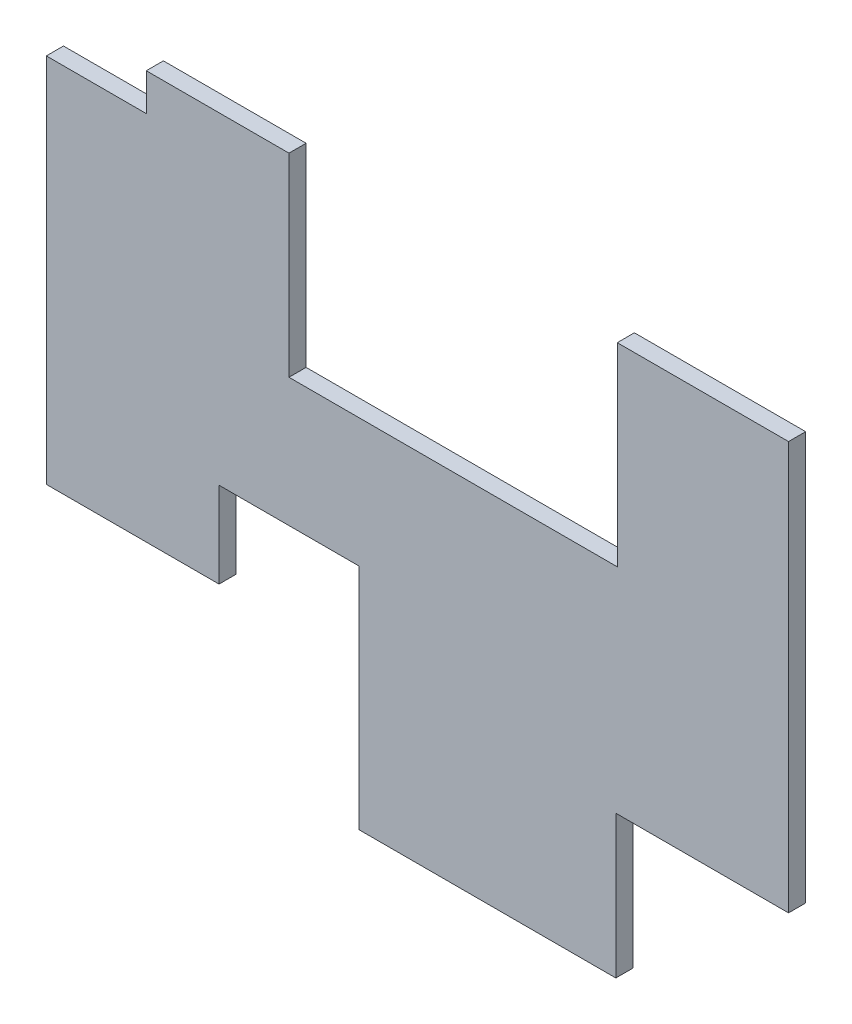
ISO-10303-21;
HEADER;
FILE_DESCRIPTION(('STEP AP214'),'2;1');
FILE_NAME('part.step','',(''),(''),'','','');
FILE_SCHEMA(('AUTOMOTIVE_DESIGN { 1 0 10303 214 1 1 1 1 }'));
ENDSEC;
DATA;
#1=APPLICATION_CONTEXT('core data for automotive mechanical design processes');
#2=APPLICATION_PROTOCOL_DEFINITION('international standard','automotive_design',2000,#1);
#3=PRODUCT_CONTEXT('',#1,'mechanical');
#4=PRODUCT('Part','Part','',(#3));
#5=PRODUCT_RELATED_PRODUCT_CATEGORY('part','',(#4));
#6=PRODUCT_DEFINITION_FORMATION('','',#4);
#7=PRODUCT_DEFINITION_CONTEXT('part definition',#1,'design');
#8=PRODUCT_DEFINITION('design','',#6,#7);
#9=PRODUCT_DEFINITION_SHAPE('','',#8);
#10=(LENGTH_UNIT() NAMED_UNIT(*) SI_UNIT(.MILLI.,.METRE.));
#11=(NAMED_UNIT(*) PLANE_ANGLE_UNIT() SI_UNIT($,.RADIAN.));
#12=(NAMED_UNIT(*) SI_UNIT($,.STERADIAN.) SOLID_ANGLE_UNIT());
#13=UNCERTAINTY_MEASURE_WITH_UNIT(LENGTH_MEASURE(1.E-05),#10,'distance_accuracy_value','');
#14=(GEOMETRIC_REPRESENTATION_CONTEXT(3) GLOBAL_UNCERTAINTY_ASSIGNED_CONTEXT((#13)) GLOBAL_UNIT_ASSIGNED_CONTEXT((#10,
#11,#12)) REPRESENTATION_CONTEXT('',''));
#15=CARTESIAN_POINT('',(0.,0.,0.));
#16=DIRECTION('',(0.,0.,1.));
#17=DIRECTION('',(1.,0.,0.));
#18=AXIS2_PLACEMENT_3D('',#15,#16,#17);
#19=CARTESIAN_POINT('',(0.,-46.5,6.));
#20=DIRECTION('',(0.,-1.,0.));
#21=DIRECTION('',(0.,0.,-1.));
#22=AXIS2_PLACEMENT_3D('',#19,#20,#21);
#23=PLANE('',#22);
#24=DIRECTION('',(-1.,0.,0.));
#25=VECTOR('',#24,1.);
#26=CARTESIAN_POINT('',(0.,-46.5,0.));
#27=LINE('',#26,#25);
#28=CARTESIAN_POINT('',(-69.5000000000001,-46.5,0.));
#29=VERTEX_POINT('',#28);
#30=CARTESIAN_POINT('',(-130.,-46.5,0.));
#31=VERTEX_POINT('',#30);
#32=EDGE_CURVE('E176',#29,#31,#27,.T.);
#33=ORIENTED_EDGE('',*,*,#32,.F.);
#34=DIRECTION('',(0.,0.,-1.));
#35=VECTOR('',#34,1.);
#36=CARTESIAN_POINT('',(-69.5000000000001,-46.5,6.));
#37=LINE('',#36,#35);
#38=CARTESIAN_POINT('',(-69.5000000000001,-46.5,6.));
#39=VERTEX_POINT('',#38);
#40=EDGE_CURVE('E11',#39,#29,#37,.T.);
#41=ORIENTED_EDGE('',*,*,#40,.F.);
#42=DIRECTION('',(-1.,0.,0.));
#43=VECTOR('',#42,1.);
#44=CARTESIAN_POINT('',(0.,-46.5,6.));
#45=LINE('',#44,#43);
#46=CARTESIAN_POINT('',(-130.,-46.5,6.));
#47=VERTEX_POINT('',#46);
#48=EDGE_CURVE('E213',#39,#47,#45,.T.);
#49=ORIENTED_EDGE('',*,*,#48,.T.);
#50=DIRECTION('',(0.,0.,-1.));
#51=VECTOR('',#50,1.);
#52=CARTESIAN_POINT('',(-130.,-46.5,6.));
#53=LINE('',#52,#51);
#54=EDGE_CURVE('E51',#47,#31,#53,.T.);
#55=ORIENTED_EDGE('',*,*,#54,.T.);
#56=EDGE_LOOP('',(#33,#41,#49,#55));
#57=FACE_BOUND('',#56,.T.);
#58=ADVANCED_FACE('F35',(#57),#23,.T.);
#59=CARTESIAN_POINT('',(-69.5000000000001,0.,6.));
#60=DIRECTION('',(1.,0.,0.));
#61=DIRECTION('',(0.,1.,0.));
#62=AXIS2_PLACEMENT_3D('',#59,#60,#61);
#63=PLANE('',#62);
#64=DIRECTION('',(0.,-1.,0.));
#65=VECTOR('',#64,1.);
#66=CARTESIAN_POINT('',(-69.5000000000001,0.,0.));
#67=LINE('',#66,#65);
#68=CARTESIAN_POINT('',(-69.5000000000001,-16.5,0.));
#69=VERTEX_POINT('',#68);
#70=EDGE_CURVE('E178',#69,#29,#67,.T.);
#71=ORIENTED_EDGE('',*,*,#70,.F.);
#72=DIRECTION('',(0.,0.,-1.));
#73=VECTOR('',#72,1.);
#74=CARTESIAN_POINT('',(-69.5000000000001,-16.5,6.));
#75=LINE('',#74,#73);
#76=CARTESIAN_POINT('',(-69.5000000000001,-16.5,6.));
#77=VERTEX_POINT('',#76);
#78=EDGE_CURVE('E43',#77,#69,#75,.T.);
#79=ORIENTED_EDGE('',*,*,#78,.F.);
#80=DIRECTION('',(0.,-1.,0.));
#81=VECTOR('',#80,1.);
#82=CARTESIAN_POINT('',(-69.5000000000001,0.,6.));
#83=LINE('',#82,#81);
#84=EDGE_CURVE('E256',#77,#39,#83,.T.);
#85=ORIENTED_EDGE('',*,*,#84,.T.);
#86=ORIENTED_EDGE('',*,*,#40,.T.);
#87=EDGE_LOOP('',(#71,#79,#85,#86));
#88=FACE_BOUND('',#87,.T.);
#89=ADVANCED_FACE('F255',(#88),#63,.T.);
#90=CARTESIAN_POINT('',(0.,-16.5,6.));
#91=DIRECTION('',(0.,1.,0.));
#92=DIRECTION('',(0.,0.,1.));
#93=AXIS2_PLACEMENT_3D('',#90,#91,#92);
#94=PLANE('',#93);
#95=DIRECTION('',(1.,0.,0.));
#96=VECTOR('',#95,1.);
#97=CARTESIAN_POINT('',(0.,-16.5,0.));
#98=LINE('',#97,#96);
#99=CARTESIAN_POINT('',(-20.5,-16.5,0.));
#100=VERTEX_POINT('',#99);
#101=EDGE_CURVE('E181',#69,#100,#98,.T.);
#102=ORIENTED_EDGE('',*,*,#101,.T.);
#103=DIRECTION('',(0.,0.,-1.));
#104=VECTOR('',#103,1.);
#105=CARTESIAN_POINT('',(-20.5,-16.5,6.));
#106=LINE('',#105,#104);
#107=CARTESIAN_POINT('',(-20.5,-16.5,6.));
#108=VERTEX_POINT('',#107);
#109=EDGE_CURVE('E239',#108,#100,#106,.T.);
#110=ORIENTED_EDGE('',*,*,#109,.F.);
#111=DIRECTION('',(1.,0.,0.));
#112=VECTOR('',#111,1.);
#113=CARTESIAN_POINT('',(0.,-16.5,6.));
#114=LINE('',#113,#112);
#115=EDGE_CURVE('E246',#77,#108,#114,.T.);
#116=ORIENTED_EDGE('',*,*,#115,.F.);
#117=ORIENTED_EDGE('',*,*,#78,.T.);
#118=EDGE_LOOP('',(#102,#110,#116,#117));
#119=FACE_BOUND('',#118,.T.);
#120=ADVANCED_FACE('F244',(#119),#94,.F.);
#121=CARTESIAN_POINT('',(-20.5,0.,6.));
#122=DIRECTION('',(1.,0.,0.));
#123=DIRECTION('',(0.,1.,0.));
#124=AXIS2_PLACEMENT_3D('',#121,#122,#123);
#125=PLANE('',#124);
#126=DIRECTION('',(0.,-1.,0.));
#127=VECTOR('',#126,1.);
#128=CARTESIAN_POINT('',(-20.5,0.,0.));
#129=LINE('',#128,#127);
#130=CARTESIAN_POINT('',(-20.5,-96.5,0.));
#131=VERTEX_POINT('',#130);
#132=EDGE_CURVE('E183',#100,#131,#129,.T.);
#133=ORIENTED_EDGE('',*,*,#132,.T.);
#134=DIRECTION('',(0.,0.,-1.));
#135=VECTOR('',#134,1.);
#136=CARTESIAN_POINT('',(-20.5,-96.5,6.));
#137=LINE('',#136,#135);
#138=CARTESIAN_POINT('',(-20.5,-96.5,6.));
#139=VERTEX_POINT('',#138);
#140=EDGE_CURVE('E236',#139,#131,#137,.T.);
#141=ORIENTED_EDGE('',*,*,#140,.F.);
#142=DIRECTION('',(0.,-1.,0.));
#143=VECTOR('',#142,1.);
#144=CARTESIAN_POINT('',(-20.5,0.,6.));
#145=LINE('',#144,#143);
#146=EDGE_CURVE('E452',#108,#139,#145,.T.);
#147=ORIENTED_EDGE('',*,*,#146,.F.);
#148=ORIENTED_EDGE('',*,*,#109,.T.);
#149=EDGE_LOOP('',(#133,#141,#147,#148));
#150=FACE_BOUND('',#149,.T.);
#151=ADVANCED_FACE('F274',(#150),#125,.F.);
#152=CARTESIAN_POINT('',(0.,-96.5,6.));
#153=DIRECTION('',(0.,1.,0.));
#154=DIRECTION('',(0.,0.,1.));
#155=AXIS2_PLACEMENT_3D('',#152,#153,#154);
#156=PLANE('',#155);
#157=DIRECTION('',(1.,0.,0.));
#158=VECTOR('',#157,1.);
#159=CARTESIAN_POINT('',(0.,-96.5,0.));
#160=LINE('',#159,#158);
#161=CARTESIAN_POINT('',(69.5,-96.5,0.));
#162=VERTEX_POINT('',#161);
#163=EDGE_CURVE('E185',#131,#162,#160,.T.);
#164=ORIENTED_EDGE('',*,*,#163,.T.);
#165=DIRECTION('',(0.,0.,-1.));
#166=VECTOR('',#165,1.);
#167=CARTESIAN_POINT('',(69.5,-96.5,6.));
#168=LINE('',#167,#166);
#169=CARTESIAN_POINT('',(69.5,-96.5,6.));
#170=VERTEX_POINT('',#169);
#171=EDGE_CURVE('E233',#170,#162,#168,.T.);
#172=ORIENTED_EDGE('',*,*,#171,.F.);
#173=DIRECTION('',(1.,0.,0.));
#174=VECTOR('',#173,1.);
#175=CARTESIAN_POINT('',(0.,-96.5,6.));
#176=LINE('',#175,#174);
#177=EDGE_CURVE('E450',#139,#170,#176,.T.);
#178=ORIENTED_EDGE('',*,*,#177,.F.);
#179=ORIENTED_EDGE('',*,*,#140,.T.);
#180=EDGE_LOOP('',(#164,#172,#178,#179));
#181=FACE_BOUND('',#180,.T.);
#182=ADVANCED_FACE('F279',(#181),#156,.F.);
#183=CARTESIAN_POINT('',(69.5,0.,6.));
#184=DIRECTION('',(-1.,0.,0.));
#185=DIRECTION('',(0.,-1.,0.));
#186=AXIS2_PLACEMENT_3D('',#183,#184,#185);
#187=PLANE('',#186);
#188=DIRECTION('',(0.,1.,0.));
#189=VECTOR('',#188,1.);
#190=CARTESIAN_POINT('',(69.5,0.,0.));
#191=LINE('',#190,#189);
#192=CARTESIAN_POINT('',(69.5,-46.5,0.));
#193=VERTEX_POINT('',#192);
#194=EDGE_CURVE('E187',#162,#193,#191,.T.);
#195=ORIENTED_EDGE('',*,*,#194,.T.);
#196=DIRECTION('',(0.,0.,-1.));
#197=VECTOR('',#196,1.);
#198=CARTESIAN_POINT('',(69.5,-46.5,6.));
#199=LINE('',#198,#197);
#200=CARTESIAN_POINT('',(69.5,-46.5,6.));
#201=VERTEX_POINT('',#200);
#202=EDGE_CURVE('E230',#201,#193,#199,.T.);
#203=ORIENTED_EDGE('',*,*,#202,.F.);
#204=DIRECTION('',(0.,1.,0.));
#205=VECTOR('',#204,1.);
#206=CARTESIAN_POINT('',(69.5,0.,6.));
#207=LINE('',#206,#205);
#208=EDGE_CURVE('E448',#170,#201,#207,.T.);
#209=ORIENTED_EDGE('',*,*,#208,.F.);
#210=ORIENTED_EDGE('',*,*,#171,.T.);
#211=EDGE_LOOP('',(#195,#203,#209,#210));
#212=FACE_BOUND('',#211,.T.);
#213=ADVANCED_FACE('F283',(#212),#187,.F.);
#214=CARTESIAN_POINT('',(0.,-46.5,6.));
#215=DIRECTION('',(0.,1.,0.));
#216=DIRECTION('',(0.,0.,1.));
#217=AXIS2_PLACEMENT_3D('',#214,#215,#216);
#218=PLANE('',#217);
#219=DIRECTION('',(1.,0.,0.));
#220=VECTOR('',#219,1.);
#221=CARTESIAN_POINT('',(0.,-46.5,0.));
#222=LINE('',#221,#220);
#223=CARTESIAN_POINT('',(130.,-46.5,0.));
#224=VERTEX_POINT('',#223);
#225=EDGE_CURVE('E189',#193,#224,#222,.T.);
#226=ORIENTED_EDGE('',*,*,#225,.T.);
#227=DIRECTION('',(0.,0.,-1.));
#228=VECTOR('',#227,1.);
#229=CARTESIAN_POINT('',(130.,-46.5,6.));
#230=LINE('',#229,#228);
#231=CARTESIAN_POINT('',(130.,-46.5,6.));
#232=VERTEX_POINT('',#231);
#233=EDGE_CURVE('E227',#232,#224,#230,.T.);
#234=ORIENTED_EDGE('',*,*,#233,.F.);
#235=DIRECTION('',(1.,0.,0.));
#236=VECTOR('',#235,1.);
#237=CARTESIAN_POINT('',(0.,-46.5,6.));
#238=LINE('',#237,#236);
#239=EDGE_CURVE('E438',#201,#232,#238,.T.);
#240=ORIENTED_EDGE('',*,*,#239,.F.);
#241=ORIENTED_EDGE('',*,*,#202,.T.);
#242=EDGE_LOOP('',(#226,#234,#240,#241));
#243=FACE_BOUND('',#242,.T.);
#244=ADVANCED_FACE('F287',(#243),#218,.F.);
#245=CARTESIAN_POINT('',(130.,0.,6.));
#246=DIRECTION('',(-1.,0.,0.));
#247=DIRECTION('',(0.,-1.,0.));
#248=AXIS2_PLACEMENT_3D('',#245,#246,#247);
#249=PLANE('',#248);
#250=DIRECTION('',(0.,1.,0.));
#251=VECTOR('',#250,1.);
#252=CARTESIAN_POINT('',(130.,0.,0.));
#253=LINE('',#252,#251);
#254=CARTESIAN_POINT('',(130.,96.5,0.));
#255=VERTEX_POINT('',#254);
#256=EDGE_CURVE('E191',#224,#255,#253,.T.);
#257=ORIENTED_EDGE('',*,*,#256,.T.);
#258=DIRECTION('',(0.,0.,-1.));
#259=VECTOR('',#258,1.);
#260=CARTESIAN_POINT('',(130.,96.5,6.));
#261=LINE('',#260,#259);
#262=CARTESIAN_POINT('',(130.,96.5,6.));
#263=VERTEX_POINT('',#262);
#264=EDGE_CURVE('E225',#263,#255,#261,.T.);
#265=ORIENTED_EDGE('',*,*,#264,.F.);
#266=DIRECTION('',(0.,1.,0.));
#267=VECTOR('',#266,1.);
#268=CARTESIAN_POINT('',(130.,0.,6.));
#269=LINE('',#268,#267);
#270=EDGE_CURVE('E436',#232,#263,#269,.T.);
#271=ORIENTED_EDGE('',*,*,#270,.F.);
#272=ORIENTED_EDGE('',*,*,#233,.T.);
#273=EDGE_LOOP('',(#257,#265,#271,#272));
#274=FACE_BOUND('',#273,.T.);
#275=ADVANCED_FACE('F291',(#274),#249,.F.);
#276=CARTESIAN_POINT('',(0.,96.5,6.));
#277=DIRECTION('',(0.,1.,0.));
#278=DIRECTION('',(0.,0.,1.));
#279=AXIS2_PLACEMENT_3D('',#276,#277,#278);
#280=PLANE('',#279);
#281=DIRECTION('',(1.,0.,0.));
#282=VECTOR('',#281,1.);
#283=CARTESIAN_POINT('',(0.,96.5,0.));
#284=LINE('',#283,#282);
#285=CARTESIAN_POINT('',(70.,96.5,0.));
#286=VERTEX_POINT('',#285);
#287=EDGE_CURVE('E194',#286,#255,#284,.T.);
#288=ORIENTED_EDGE('',*,*,#287,.F.);
#289=DIRECTION('',(0.,0.,-1.));
#290=VECTOR('',#289,1.);
#291=CARTESIAN_POINT('',(70.,96.5,6.));
#292=LINE('',#291,#290);
#293=CARTESIAN_POINT('',(70.,96.5,6.));
#294=VERTEX_POINT('',#293);
#295=EDGE_CURVE('E223',#294,#286,#292,.T.);
#296=ORIENTED_EDGE('',*,*,#295,.F.);
#297=DIRECTION('',(1.,0.,0.));
#298=VECTOR('',#297,1.);
#299=CARTESIAN_POINT('',(0.,96.5,6.));
#300=LINE('',#299,#298);
#301=EDGE_CURVE('E433',#294,#263,#300,.T.);
#302=ORIENTED_EDGE('',*,*,#301,.T.);
#303=ORIENTED_EDGE('',*,*,#264,.T.);
#304=EDGE_LOOP('',(#288,#296,#302,#303));
#305=FACE_BOUND('',#304,.T.);
#306=ADVANCED_FACE('F295',(#305),#280,.T.);
#307=CARTESIAN_POINT('',(70.,0.,6.));
#308=DIRECTION('',(1.,0.,0.));
#309=DIRECTION('',(0.,0.,-1.));
#310=AXIS2_PLACEMENT_3D('',#307,#308,#309);
#311=PLANE('',#310);
#312=DIRECTION('',(0.,-1.,0.));
#313=VECTOR('',#312,1.);
#314=CARTESIAN_POINT('',(70.,0.,0.));
#315=LINE('',#314,#313);
#316=CARTESIAN_POINT('',(70.,28.5,0.));
#317=VERTEX_POINT('',#316);
#318=EDGE_CURVE('E197',#286,#317,#315,.T.);
#319=ORIENTED_EDGE('',*,*,#318,.T.);
#320=DIRECTION('',(0.,0.,-1.));
#321=VECTOR('',#320,1.);
#322=CARTESIAN_POINT('',(70.,28.5,6.));
#323=LINE('',#322,#321);
#324=CARTESIAN_POINT('',(70.,28.5,6.));
#325=VERTEX_POINT('',#324);
#326=EDGE_CURVE('E221',#325,#317,#323,.T.);
#327=ORIENTED_EDGE('',*,*,#326,.F.);
#328=DIRECTION('',(0.,-1.,0.));
#329=VECTOR('',#328,1.);
#330=CARTESIAN_POINT('',(70.,0.,6.));
#331=LINE('',#330,#329);
#332=EDGE_CURVE('E429',#294,#325,#331,.T.);
#333=ORIENTED_EDGE('',*,*,#332,.F.);
#334=ORIENTED_EDGE('',*,*,#295,.T.);
#335=EDGE_LOOP('',(#319,#327,#333,#334));
#336=FACE_BOUND('',#335,.T.);
#337=ADVANCED_FACE('F297',(#336),#311,.F.);
#338=CARTESIAN_POINT('',(0.,28.5,6.));
#339=DIRECTION('',(0.,1.,0.));
#340=DIRECTION('',(0.,0.,1.));
#341=AXIS2_PLACEMENT_3D('',#338,#339,#340);
#342=PLANE('',#341);
#343=DIRECTION('',(1.,0.,0.));
#344=VECTOR('',#343,1.);
#345=CARTESIAN_POINT('',(0.,28.5,0.));
#346=LINE('',#345,#344);
#347=CARTESIAN_POINT('',(-45.,28.5,0.));
#348=VERTEX_POINT('',#347);
#349=EDGE_CURVE('E201',#348,#317,#346,.T.);
#350=ORIENTED_EDGE('',*,*,#349,.F.);
#351=DIRECTION('',(0.,0.,-1.));
#352=VECTOR('',#351,1.);
#353=CARTESIAN_POINT('',(-45.,28.5,6.));
#354=LINE('',#353,#352);
#355=CARTESIAN_POINT('',(-45.,28.5,6.));
#356=VERTEX_POINT('',#355);
#357=EDGE_CURVE('E219',#356,#348,#354,.T.);
#358=ORIENTED_EDGE('',*,*,#357,.F.);
#359=DIRECTION('',(1.,0.,0.));
#360=VECTOR('',#359,1.);
#361=CARTESIAN_POINT('',(0.,28.5,6.));
#362=LINE('',#361,#360);
#363=EDGE_CURVE('E432',#356,#325,#362,.T.);
#364=ORIENTED_EDGE('',*,*,#363,.T.);
#365=ORIENTED_EDGE('',*,*,#326,.T.);
#366=EDGE_LOOP('',(#350,#358,#364,#365));
#367=FACE_BOUND('',#366,.T.);
#368=ADVANCED_FACE('F300',(#367),#342,.T.);
#369=CARTESIAN_POINT('',(-45.,0.,6.));
#370=DIRECTION('',(1.,0.,0.));
#371=DIRECTION('',(0.,1.,0.));
#372=AXIS2_PLACEMENT_3D('',#369,#370,#371);
#373=PLANE('',#372);
#374=DIRECTION('',(0.,-1.,0.));
#375=VECTOR('',#374,1.);
#376=CARTESIAN_POINT('',(-45.,0.,0.));
#377=LINE('',#376,#375);
#378=CARTESIAN_POINT('',(-45.,96.5,0.));
#379=VERTEX_POINT('',#378);
#380=EDGE_CURVE('E204',#379,#348,#377,.T.);
#381=ORIENTED_EDGE('',*,*,#380,.F.);
#382=DIRECTION('',(0.,0.,-1.));
#383=VECTOR('',#382,1.);
#384=CARTESIAN_POINT('',(-45.,96.5,6.));
#385=LINE('',#384,#383);
#386=CARTESIAN_POINT('',(-45.,96.5,6.));
#387=VERTEX_POINT('',#386);
#388=EDGE_CURVE('E217',#387,#379,#385,.T.);
#389=ORIENTED_EDGE('',*,*,#388,.F.);
#390=DIRECTION('',(0.,-1.,0.));
#391=VECTOR('',#390,1.);
#392=CARTESIAN_POINT('',(-45.,0.,6.));
#393=LINE('',#392,#391);
#394=EDGE_CURVE('E440',#387,#356,#393,.T.);
#395=ORIENTED_EDGE('',*,*,#394,.T.);
#396=ORIENTED_EDGE('',*,*,#357,.T.);
#397=EDGE_LOOP('',(#381,#389,#395,#396));
#398=FACE_BOUND('',#397,.T.);
#399=ADVANCED_FACE('F304',(#398),#373,.T.);
#400=CARTESIAN_POINT('',(-95.,96.5,0.));
#401=VERTEX_POINT('',#400);
#402=EDGE_CURVE('E198',#401,#379,#284,.T.);
#403=ORIENTED_EDGE('',*,*,#402,.F.);
#404=DIRECTION('',(0.,0.,-1.));
#405=VECTOR('',#404,1.);
#406=CARTESIAN_POINT('',(-95.,96.5,6.));
#407=LINE('',#406,#405);
#408=CARTESIAN_POINT('',(-95.,96.5,6.));
#409=VERTEX_POINT('',#408);
#410=EDGE_CURVE('E158',#409,#401,#407,.T.);
#411=ORIENTED_EDGE('',*,*,#410,.F.);
#412=EDGE_CURVE('E168',#409,#387,#300,.T.);
#413=ORIENTED_EDGE('',*,*,#412,.T.);
#414=ORIENTED_EDGE('',*,*,#388,.T.);
#415=EDGE_LOOP('',(#403,#411,#413,#414));
#416=FACE_BOUND('',#415,.T.);
#417=ADVANCED_FACE('F308',(#416),#280,.T.);
#418=CARTESIAN_POINT('',(-95.,0.,6.));
#419=DIRECTION('',(-1.,0.,0.));
#420=DIRECTION('',(0.,0.,1.));
#421=AXIS2_PLACEMENT_3D('',#418,#419,#420);
#422=PLANE('',#421);
#423=DIRECTION('',(0.,1.,0.));
#424=VECTOR('',#423,1.);
#425=CARTESIAN_POINT('',(-95.,0.,0.));
#426=LINE('',#425,#424);
#427=CARTESIAN_POINT('',(-95.,83.5,0.));
#428=VERTEX_POINT('',#427);
#429=EDGE_CURVE('E154',#428,#401,#426,.T.);
#430=ORIENTED_EDGE('',*,*,#429,.F.);
#431=DIRECTION('',(0.,0.,-1.));
#432=VECTOR('',#431,1.);
#433=CARTESIAN_POINT('',(-95.,83.5,6.));
#434=LINE('',#433,#432);
#435=CARTESIAN_POINT('',(-95.,83.5,6.));
#436=VERTEX_POINT('',#435);
#437=EDGE_CURVE('E149',#436,#428,#434,.T.);
#438=ORIENTED_EDGE('',*,*,#437,.F.);
#439=DIRECTION('',(0.,1.,0.));
#440=VECTOR('',#439,1.);
#441=CARTESIAN_POINT('',(-95.,0.,6.));
#442=LINE('',#441,#440);
#443=EDGE_CURVE('E152',#436,#409,#442,.T.);
#444=ORIENTED_EDGE('',*,*,#443,.T.);
#445=ORIENTED_EDGE('',*,*,#410,.T.);
#446=EDGE_LOOP('',(#430,#438,#444,#445));
#447=FACE_BOUND('',#446,.T.);
#448=ADVANCED_FACE('F151',(#447),#422,.T.);
#449=CARTESIAN_POINT('',(0.,83.5,6.));
#450=DIRECTION('',(0.,1.,0.));
#451=DIRECTION('',(0.,0.,1.));
#452=AXIS2_PLACEMENT_3D('',#449,#450,#451);
#453=PLANE('',#452);
#454=DIRECTION('',(1.,0.,0.));
#455=VECTOR('',#454,1.);
#456=CARTESIAN_POINT('',(0.,83.5,0.));
#457=LINE('',#456,#455);
#458=CARTESIAN_POINT('',(-130.,83.5,0.));
#459=VERTEX_POINT('',#458);
#460=EDGE_CURVE('E208',#459,#428,#457,.T.);
#461=ORIENTED_EDGE('',*,*,#460,.F.);
#462=DIRECTION('',(0.,0.,-1.));
#463=VECTOR('',#462,1.);
#464=CARTESIAN_POINT('',(-130.,83.5,6.));
#465=LINE('',#464,#463);
#466=CARTESIAN_POINT('',(-130.,83.5,6.));
#467=VERTEX_POINT('',#466);
#468=EDGE_CURVE('E100',#467,#459,#465,.T.);
#469=ORIENTED_EDGE('',*,*,#468,.F.);
#470=DIRECTION('',(1.,0.,0.));
#471=VECTOR('',#470,1.);
#472=CARTESIAN_POINT('',(0.,83.5,6.));
#473=LINE('',#472,#471);
#474=EDGE_CURVE('E165',#467,#436,#473,.T.);
#475=ORIENTED_EDGE('',*,*,#474,.T.);
#476=ORIENTED_EDGE('',*,*,#437,.T.);
#477=EDGE_LOOP('',(#461,#469,#475,#476));
#478=FACE_BOUND('',#477,.T.);
#479=ADVANCED_FACE('F170',(#478),#453,.T.);
#480=CARTESIAN_POINT('',(-130.,0.,6.));
#481=DIRECTION('',(-1.,0.,0.));
#482=DIRECTION('',(0.,0.,1.));
#483=AXIS2_PLACEMENT_3D('',#480,#481,#482);
#484=PLANE('',#483);
#485=DIRECTION('',(0.,1.,0.));
#486=VECTOR('',#485,1.);
#487=CARTESIAN_POINT('',(-130.,0.,0.));
#488=LINE('',#487,#486);
#489=EDGE_CURVE('E210',#31,#459,#488,.T.);
#490=ORIENTED_EDGE('',*,*,#489,.F.);
#491=ORIENTED_EDGE('',*,*,#54,.F.);
#492=DIRECTION('',(0.,1.,0.));
#493=VECTOR('',#492,1.);
#494=CARTESIAN_POINT('',(-130.,0.,6.));
#495=LINE('',#494,#493);
#496=EDGE_CURVE('E171',#47,#467,#495,.T.);
#497=ORIENTED_EDGE('',*,*,#496,.T.);
#498=ORIENTED_EDGE('',*,*,#468,.T.);
#499=EDGE_LOOP('',(#490,#491,#497,#498));
#500=FACE_BOUND('',#499,.T.);
#501=ADVANCED_FACE('F257',(#500),#484,.T.);
#502=CARTESIAN_POINT('',(0.,0.,6.));
#503=DIRECTION('',(0.,0.,1.));
#504=DIRECTION('',(1.,0.,0.));
#505=AXIS2_PLACEMENT_3D('',#502,#503,#504);
#506=PLANE('',#505);
#507=ORIENTED_EDGE('',*,*,#48,.F.);
#508=ORIENTED_EDGE('',*,*,#84,.F.);
#509=ORIENTED_EDGE('',*,*,#115,.T.);
#510=ORIENTED_EDGE('',*,*,#146,.T.);
#511=ORIENTED_EDGE('',*,*,#177,.T.);
#512=ORIENTED_EDGE('',*,*,#208,.T.);
#513=ORIENTED_EDGE('',*,*,#239,.T.);
#514=ORIENTED_EDGE('',*,*,#270,.T.);
#515=ORIENTED_EDGE('',*,*,#301,.F.);
#516=ORIENTED_EDGE('',*,*,#332,.T.);
#517=ORIENTED_EDGE('',*,*,#363,.F.);
#518=ORIENTED_EDGE('',*,*,#394,.F.);
#519=ORIENTED_EDGE('',*,*,#412,.F.);
#520=ORIENTED_EDGE('',*,*,#443,.F.);
#521=ORIENTED_EDGE('',*,*,#474,.F.);
#522=ORIENTED_EDGE('',*,*,#496,.F.);
#523=EDGE_LOOP('',(#507,#508,#509,#510,#511,#512,#513,#514,#515,#516,#517,#518,#519,#520,#521,#522));
#524=FACE_BOUND('',#523,.T.);
#525=ADVANCED_FACE('F163',(#524),#506,.T.);
#526=CARTESIAN_POINT('',(0.,0.,0.));
#527=DIRECTION('',(0.,0.,1.));
#528=DIRECTION('',(1.,0.,0.));
#529=AXIS2_PLACEMENT_3D('',#526,#527,#528);
#530=PLANE('',#529);
#531=ORIENTED_EDGE('',*,*,#32,.T.);
#532=ORIENTED_EDGE('',*,*,#489,.T.);
#533=ORIENTED_EDGE('',*,*,#460,.T.);
#534=ORIENTED_EDGE('',*,*,#429,.T.);
#535=ORIENTED_EDGE('',*,*,#402,.T.);
#536=ORIENTED_EDGE('',*,*,#380,.T.);
#537=ORIENTED_EDGE('',*,*,#349,.T.);
#538=ORIENTED_EDGE('',*,*,#318,.F.);
#539=ORIENTED_EDGE('',*,*,#287,.T.);
#540=ORIENTED_EDGE('',*,*,#256,.F.);
#541=ORIENTED_EDGE('',*,*,#225,.F.);
#542=ORIENTED_EDGE('',*,*,#194,.F.);
#543=ORIENTED_EDGE('',*,*,#163,.F.);
#544=ORIENTED_EDGE('',*,*,#132,.F.);
#545=ORIENTED_EDGE('',*,*,#101,.F.);
#546=ORIENTED_EDGE('',*,*,#70,.T.);
#547=EDGE_LOOP('',(#531,#532,#533,#534,#535,#536,#537,#538,#539,#540,#541,#542,#543,#544,#545,#546));
#548=FACE_BOUND('',#547,.T.);
#549=ADVANCED_FACE('F253',(#548),#530,.F.);
#550=CLOSED_SHELL('',(#58,#89,#120,#151,#182,#213,#244,#275,#306,#337,#368,#399,#417,#448,#479,
#501,#525,#549));
#551=MANIFOLD_SOLID_BREP('B2',#550);
#552=ADVANCED_BREP_SHAPE_REPRESENTATION('',(#18,#551),#14);
#553=SHAPE_DEFINITION_REPRESENTATION(#9,#552);
ENDSEC;
END-ISO-10303-21;
